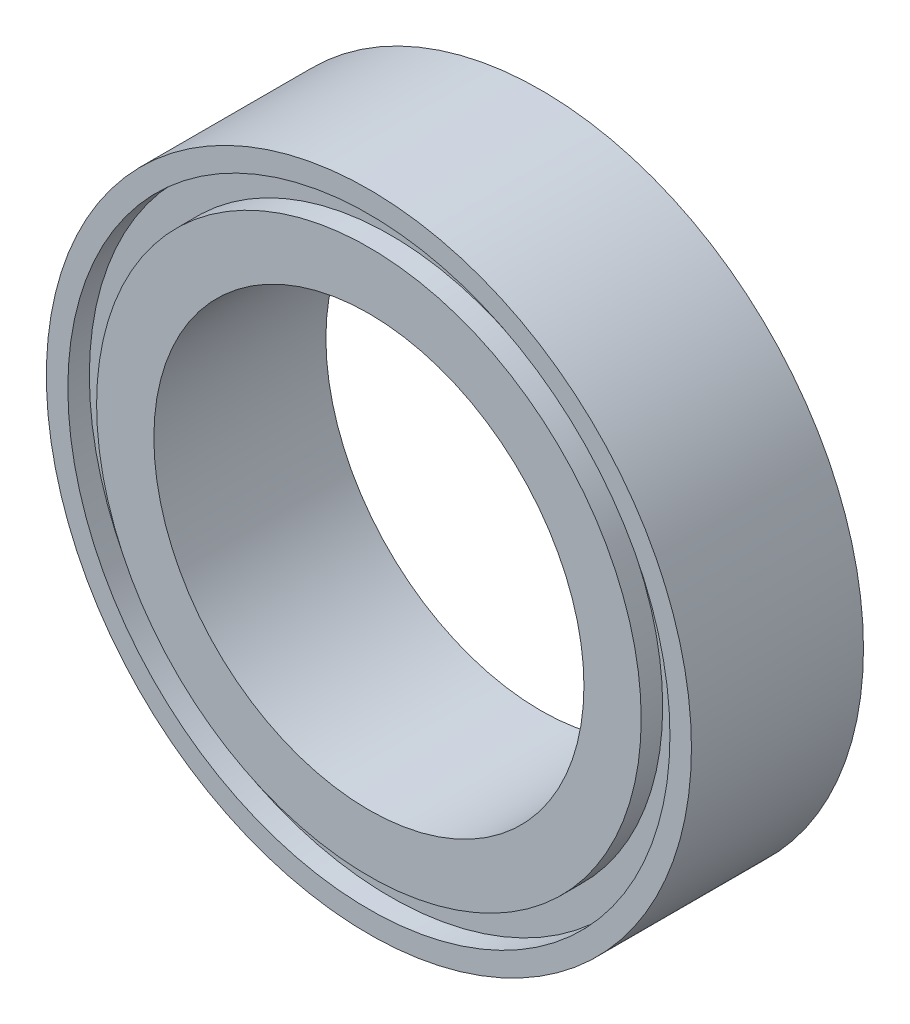
ISO-10303-21;
HEADER;
FILE_DESCRIPTION(('STEP AP214'),'2;1');
FILE_NAME('part.step','',(''),(''),'','','');
FILE_SCHEMA(('AUTOMOTIVE_DESIGN { 1 0 10303 214 1 1 1 1 }'));
ENDSEC;
DATA;
#1=APPLICATION_CONTEXT('core data for automotive mechanical design processes');
#2=APPLICATION_PROTOCOL_DEFINITION('international standard','automotive_design',2000,#1);
#3=PRODUCT_CONTEXT('',#1,'mechanical');
#4=PRODUCT('Part','Part','',(#3));
#5=PRODUCT_RELATED_PRODUCT_CATEGORY('part','',(#4));
#6=PRODUCT_DEFINITION_FORMATION('','',#4);
#7=PRODUCT_DEFINITION_CONTEXT('part definition',#1,'design');
#8=PRODUCT_DEFINITION('design','',#6,#7);
#9=PRODUCT_DEFINITION_SHAPE('','',#8);
#10=(LENGTH_UNIT() NAMED_UNIT(*) SI_UNIT(.MILLI.,.METRE.));
#11=(NAMED_UNIT(*) PLANE_ANGLE_UNIT() SI_UNIT($,.RADIAN.));
#12=(NAMED_UNIT(*) SI_UNIT($,.STERADIAN.) SOLID_ANGLE_UNIT());
#13=UNCERTAINTY_MEASURE_WITH_UNIT(LENGTH_MEASURE(1.E-05),#10,'distance_accuracy_value','');
#14=(GEOMETRIC_REPRESENTATION_CONTEXT(3) GLOBAL_UNCERTAINTY_ASSIGNED_CONTEXT((#13)) GLOBAL_UNIT_ASSIGNED_CONTEXT((#10,
#11,#12)) REPRESENTATION_CONTEXT('',''));
#15=CARTESIAN_POINT('',(0.,0.,0.));
#16=DIRECTION('',(0.,0.,1.));
#17=DIRECTION('',(1.,0.,0.));
#18=AXIS2_PLACEMENT_3D('',#15,#16,#17);
#19=CARTESIAN_POINT('',(0.,0.,-2.));
#20=DIRECTION('',(0.,0.,1.));
#21=DIRECTION('',(1.,0.,0.));
#22=AXIS2_PLACEMENT_3D('',#19,#20,#21);
#23=PLANE('',#22);
#24=CARTESIAN_POINT('',(0.,0.,-2.));
#25=DIRECTION('',(0.,0.,1.));
#26=DIRECTION('',(1.,0.,0.));
#27=AXIS2_PLACEMENT_3D('',#24,#25,#26);
#28=CIRCLE('',#27,5.);
#29=CARTESIAN_POINT('',(5.,0.,-2.));
#30=VERTEX_POINT('',#29);
#31=EDGE_CURVE('E54',#30,#30,#28,.T.);
#32=ORIENTED_EDGE('',*,*,#31,.T.);
#33=EDGE_LOOP('',(#32));
#34=FACE_BOUND('',#33,.T.);
#35=CARTESIAN_POINT('',(0.,0.,-2.));
#36=DIRECTION('',(0.,0.,1.));
#37=DIRECTION('',(1.,0.,0.));
#38=AXIS2_PLACEMENT_3D('',#35,#36,#37);
#39=CIRCLE('',#38,6.3315896021912);
#40=CARTESIAN_POINT('',(6.3315896021912,0.,-2.));
#41=VERTEX_POINT('',#40);
#42=EDGE_CURVE('E86',#41,#41,#39,.T.);
#43=ORIENTED_EDGE('',*,*,#42,.F.);
#44=EDGE_LOOP('',(#43));
#45=FACE_BOUND('',#44,.T.);
#46=ADVANCED_FACE('F39',(#34,#45),#23,.F.);
#47=CARTESIAN_POINT('',(0.,0.,2.));
#48=DIRECTION('',(0.,0.,1.));
#49=DIRECTION('',(1.,0.,0.));
#50=AXIS2_PLACEMENT_3D('',#47,#48,#49);
#51=PLANE('',#50);
#52=CARTESIAN_POINT('',(0.,0.,2.));
#53=DIRECTION('',(0.,0.,1.));
#54=DIRECTION('',(1.,0.,0.));
#55=AXIS2_PLACEMENT_3D('',#52,#53,#54);
#56=CIRCLE('',#55,5.);
#57=CARTESIAN_POINT('',(5.,0.,2.));
#58=VERTEX_POINT('',#57);
#59=EDGE_CURVE('E52',#58,#58,#56,.T.);
#60=ORIENTED_EDGE('',*,*,#59,.F.);
#61=EDGE_LOOP('',(#60));
#62=FACE_BOUND('',#61,.T.);
#63=CARTESIAN_POINT('',(0.,0.,2.));
#64=DIRECTION('',(0.,0.,1.));
#65=DIRECTION('',(1.,0.,0.));
#66=AXIS2_PLACEMENT_3D('',#63,#64,#65);
#67=CIRCLE('',#66,6.3315896021912);
#68=CARTESIAN_POINT('',(6.3315896021912,0.,2.));
#69=VERTEX_POINT('',#68);
#70=EDGE_CURVE('E70',#69,#69,#67,.T.);
#71=ORIENTED_EDGE('',*,*,#70,.T.);
#72=EDGE_LOOP('',(#71));
#73=FACE_BOUND('',#72,.T.);
#74=ADVANCED_FACE('F104',(#62,#73),#51,.T.);
#75=CARTESIAN_POINT('',(0.,0.,2.));
#76=DIRECTION('',(0.,0.,1.));
#77=DIRECTION('',(1.,0.,0.));
#78=AXIS2_PLACEMENT_3D('',#75,#76,#77);
#79=CIRCLE('',#78,7.);
#80=CARTESIAN_POINT('',(7.,0.,2.));
#81=VERTEX_POINT('',#80);
#82=EDGE_CURVE('E62',#81,#81,#79,.T.);
#83=ORIENTED_EDGE('',*,*,#82,.F.);
#84=EDGE_LOOP('',(#83));
#85=FACE_BOUND('',#84,.T.);
#86=CARTESIAN_POINT('',(0.,0.,2.));
#87=DIRECTION('',(0.,0.,1.));
#88=DIRECTION('',(1.,0.,0.));
#89=AXIS2_PLACEMENT_3D('',#86,#87,#88);
#90=CIRCLE('',#89,7.5);
#91=CARTESIAN_POINT('',(7.5,0.,2.));
#92=VERTEX_POINT('',#91);
#93=EDGE_CURVE('E10',#92,#92,#90,.T.);
#94=ORIENTED_EDGE('',*,*,#93,.T.);
#95=EDGE_LOOP('',(#94));
#96=FACE_BOUND('',#95,.T.);
#97=ADVANCED_FACE('F110',(#85,#96),#51,.T.);
#98=CARTESIAN_POINT('',(0.,0.,-2.));
#99=DIRECTION('',(0.,0.,1.));
#100=DIRECTION('',(1.,0.,0.));
#101=AXIS2_PLACEMENT_3D('',#98,#99,#100);
#102=CIRCLE('',#101,7.);
#103=CARTESIAN_POINT('',(7.,0.,-2.));
#104=VERTEX_POINT('',#103);
#105=EDGE_CURVE('E78',#104,#104,#102,.T.);
#106=ORIENTED_EDGE('',*,*,#105,.T.);
#107=EDGE_LOOP('',(#106));
#108=FACE_BOUND('',#107,.T.);
#109=CARTESIAN_POINT('',(0.,0.,-2.));
#110=DIRECTION('',(0.,0.,1.));
#111=DIRECTION('',(1.,0.,0.));
#112=AXIS2_PLACEMENT_3D('',#109,#110,#111);
#113=CIRCLE('',#112,7.5);
#114=CARTESIAN_POINT('',(7.5,0.,-2.));
#115=VERTEX_POINT('',#114);
#116=EDGE_CURVE('E43',#115,#115,#113,.T.);
#117=ORIENTED_EDGE('',*,*,#116,.F.);
#118=EDGE_LOOP('',(#117));
#119=FACE_BOUND('',#118,.T.);
#120=ADVANCED_FACE('F106',(#108,#119),#23,.F.);
#121=CARTESIAN_POINT('',(0.,0.,2.));
#122=DIRECTION('',(0.,0.,-1.));
#123=DIRECTION('',(-1.,0.,0.));
#124=AXIS2_PLACEMENT_3D('',#121,#122,#123);
#125=CYLINDRICAL_SURFACE('',#124,7.5);
#126=ORIENTED_EDGE('',*,*,#93,.F.);
#127=EDGE_LOOP('',(#126));
#128=FACE_BOUND('',#127,.T.);
#129=ORIENTED_EDGE('',*,*,#116,.T.);
#130=EDGE_LOOP('',(#129));
#131=FACE_BOUND('',#130,.T.);
#132=ADVANCED_FACE('F41',(#128,#131),#125,.T.);
#133=CARTESIAN_POINT('',(0.,0.,2.));
#134=DIRECTION('',(0.,0.,-1.));
#135=DIRECTION('',(-1.,0.,0.));
#136=AXIS2_PLACEMENT_3D('',#133,#134,#135);
#137=CYLINDRICAL_SURFACE('',#136,5.);
#138=ORIENTED_EDGE('',*,*,#59,.T.);
#139=EDGE_LOOP('',(#138));
#140=FACE_BOUND('',#139,.T.);
#141=ORIENTED_EDGE('',*,*,#31,.F.);
#142=EDGE_LOOP('',(#141));
#143=FACE_BOUND('',#142,.T.);
#144=ADVANCED_FACE('F119',(#140,#143),#137,.F.);
#145=CARTESIAN_POINT('',(0.,0.,1.5));
#146=DIRECTION('',(0.,0.,1.));
#147=DIRECTION('',(1.,0.,0.));
#148=AXIS2_PLACEMENT_3D('',#145,#146,#147);
#149=CYLINDRICAL_SURFACE('',#148,7.);
#150=CARTESIAN_POINT('',(0.,0.,1.5));
#151=DIRECTION('',(0.,0.,1.));
#152=DIRECTION('',(1.,0.,0.));
#153=AXIS2_PLACEMENT_3D('',#150,#151,#152);
#154=CIRCLE('',#153,7.);
#155=CARTESIAN_POINT('',(7.,0.,1.5));
#156=VERTEX_POINT('',#155);
#157=EDGE_CURVE('E58',#156,#156,#154,.T.);
#158=ORIENTED_EDGE('',*,*,#157,.F.);
#159=EDGE_LOOP('',(#158));
#160=FACE_BOUND('',#159,.T.);
#161=ORIENTED_EDGE('',*,*,#82,.T.);
#162=EDGE_LOOP('',(#161));
#163=FACE_BOUND('',#162,.T.);
#164=ADVANCED_FACE('F143',(#160,#163),#149,.F.);
#165=CARTESIAN_POINT('',(0.,0.,1.5));
#166=DIRECTION('',(0.,0.,1.));
#167=DIRECTION('',(1.,0.,0.));
#168=AXIS2_PLACEMENT_3D('',#165,#166,#167);
#169=PLANE('',#168);
#170=CARTESIAN_POINT('',(0.,0.,1.5));
#171=DIRECTION('',(0.,0.,1.));
#172=DIRECTION('',(1.,0.,0.));
#173=AXIS2_PLACEMENT_3D('',#170,#171,#172);
#174=CIRCLE('',#173,6.3315896021912);
#175=CARTESIAN_POINT('',(6.3315896021912,0.,1.5));
#176=VERTEX_POINT('',#175);
#177=EDGE_CURVE('E66',#176,#176,#174,.T.);
#178=ORIENTED_EDGE('',*,*,#177,.F.);
#179=EDGE_LOOP('',(#178));
#180=FACE_BOUND('',#179,.T.);
#181=ORIENTED_EDGE('',*,*,#157,.T.);
#182=EDGE_LOOP('',(#181));
#183=FACE_BOUND('',#182,.T.);
#184=ADVANCED_FACE('F139',(#180,#183),#169,.T.);
#185=CARTESIAN_POINT('',(0.,0.,1.5));
#186=DIRECTION('',(0.,0.,1.));
#187=DIRECTION('',(1.,0.,0.));
#188=AXIS2_PLACEMENT_3D('',#185,#186,#187);
#189=CYLINDRICAL_SURFACE('',#188,6.3315896021912);
#190=ORIENTED_EDGE('',*,*,#177,.T.);
#191=EDGE_LOOP('',(#190));
#192=FACE_BOUND('',#191,.T.);
#193=ORIENTED_EDGE('',*,*,#70,.F.);
#194=EDGE_LOOP('',(#193));
#195=FACE_BOUND('',#194,.T.);
#196=ADVANCED_FACE('F133',(#192,#195),#189,.T.);
#197=CARTESIAN_POINT('',(0.,0.,-1.5));
#198=DIRECTION('',(0.,0.,-1.));
#199=DIRECTION('',(1.,0.,0.));
#200=AXIS2_PLACEMENT_3D('',#197,#198,#199);
#201=PLANE('',#200);
#202=CARTESIAN_POINT('',(0.,0.,-1.5));
#203=DIRECTION('',(0.,0.,1.));
#204=DIRECTION('',(1.,0.,0.));
#205=AXIS2_PLACEMENT_3D('',#202,#203,#204);
#206=CIRCLE('',#205,7.);
#207=CARTESIAN_POINT('',(7.,0.,-1.5));
#208=VERTEX_POINT('',#207);
#209=EDGE_CURVE('E74',#208,#208,#206,.T.);
#210=ORIENTED_EDGE('',*,*,#209,.F.);
#211=EDGE_LOOP('',(#210));
#212=FACE_BOUND('',#211,.T.);
#213=CARTESIAN_POINT('',(0.,0.,-1.5));
#214=DIRECTION('',(0.,0.,1.));
#215=DIRECTION('',(1.,0.,0.));
#216=AXIS2_PLACEMENT_3D('',#213,#214,#215);
#217=CIRCLE('',#216,6.3315896021912);
#218=CARTESIAN_POINT('',(6.3315896021912,0.,-1.5));
#219=VERTEX_POINT('',#218);
#220=EDGE_CURVE('E82',#219,#219,#217,.T.);
#221=ORIENTED_EDGE('',*,*,#220,.T.);
#222=EDGE_LOOP('',(#221));
#223=FACE_BOUND('',#222,.T.);
#224=ADVANCED_FACE('F94',(#212,#223),#201,.T.);
#225=CARTESIAN_POINT('',(0.,0.,-1.5));
#226=DIRECTION('',(0.,0.,-1.));
#227=DIRECTION('',(-1.,0.,0.));
#228=AXIS2_PLACEMENT_3D('',#225,#226,#227);
#229=CYLINDRICAL_SURFACE('',#228,7.);
#230=ORIENTED_EDGE('',*,*,#209,.T.);
#231=EDGE_LOOP('',(#230));
#232=FACE_BOUND('',#231,.T.);
#233=ORIENTED_EDGE('',*,*,#105,.F.);
#234=EDGE_LOOP('',(#233));
#235=FACE_BOUND('',#234,.T.);
#236=ADVANCED_FACE('F99',(#232,#235),#229,.F.);
#237=CARTESIAN_POINT('',(0.,0.,-1.5));
#238=DIRECTION('',(0.,0.,-1.));
#239=DIRECTION('',(-1.,0.,0.));
#240=AXIS2_PLACEMENT_3D('',#237,#238,#239);
#241=CYLINDRICAL_SURFACE('',#240,6.3315896021912);
#242=ORIENTED_EDGE('',*,*,#220,.F.);
#243=EDGE_LOOP('',(#242));
#244=FACE_BOUND('',#243,.T.);
#245=ORIENTED_EDGE('',*,*,#42,.T.);
#246=EDGE_LOOP('',(#245));
#247=FACE_BOUND('',#246,.T.);
#248=ADVANCED_FACE('F96',(#244,#247),#241,.T.);
#249=CLOSED_SHELL('',(#46,#74,#97,#120,#132,#144,#164,#184,#196,#224,#236,#248));
#250=MANIFOLD_SOLID_BREP('B2',#249);
#251=ADVANCED_BREP_SHAPE_REPRESENTATION('',(#18,#250),#14);
#252=SHAPE_DEFINITION_REPRESENTATION(#9,#251);
ENDSEC;
END-ISO-10303-21;
